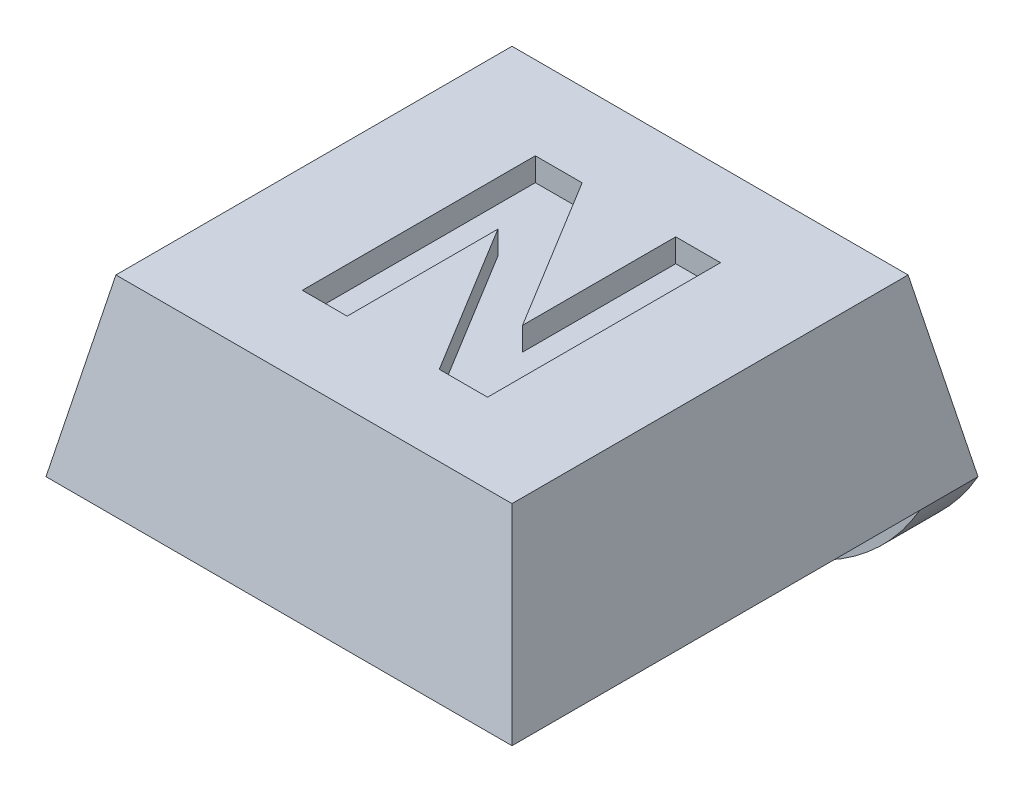
ISO-10303-21;
HEADER;
FILE_DESCRIPTION(('STEP AP214'),'2;1');
FILE_NAME('part.step','',(''),(''),'','','');
FILE_SCHEMA(('AUTOMOTIVE_DESIGN { 1 0 10303 214 1 1 1 1 }'));
ENDSEC;
DATA;
#1=APPLICATION_CONTEXT('core data for automotive mechanical design processes');
#2=APPLICATION_PROTOCOL_DEFINITION('international standard','automotive_design',2000,#1);
#3=PRODUCT_CONTEXT('',#1,'mechanical');
#4=PRODUCT('Part','Part','',(#3));
#5=PRODUCT_RELATED_PRODUCT_CATEGORY('part','',(#4));
#6=PRODUCT_DEFINITION_FORMATION('','',#4);
#7=PRODUCT_DEFINITION_CONTEXT('part definition',#1,'design');
#8=PRODUCT_DEFINITION('design','',#6,#7);
#9=PRODUCT_DEFINITION_SHAPE('','',#8);
#10=(LENGTH_UNIT() NAMED_UNIT(*) SI_UNIT(.MILLI.,.METRE.));
#11=(NAMED_UNIT(*) PLANE_ANGLE_UNIT() SI_UNIT($,.RADIAN.));
#12=(NAMED_UNIT(*) SI_UNIT($,.STERADIAN.) SOLID_ANGLE_UNIT());
#13=UNCERTAINTY_MEASURE_WITH_UNIT(LENGTH_MEASURE(1.E-05),#10,'distance_accuracy_value','');
#14=(GEOMETRIC_REPRESENTATION_CONTEXT(3) GLOBAL_UNCERTAINTY_ASSIGNED_CONTEXT((#13)) GLOBAL_UNIT_ASSIGNED_CONTEXT((#10,
#11,#12)) REPRESENTATION_CONTEXT('',''));
#15=CARTESIAN_POINT('',(0.,0.,0.));
#16=DIRECTION('',(0.,0.,1.));
#17=DIRECTION('',(1.,0.,0.));
#18=AXIS2_PLACEMENT_3D('',#15,#16,#17);
#19=CARTESIAN_POINT('',(0.,3.,0.));
#20=DIRECTION('',(0.,-1.,0.));
#21=DIRECTION('',(0.,0.,-1.));
#22=AXIS2_PLACEMENT_3D('',#19,#20,#21);
#23=PLANE('',#22);
#24=DIRECTION('',(-1.,0.,0.));
#25=VECTOR('',#24,1.);
#26=CARTESIAN_POINT('',(11.,3.,-0.6));
#27=LINE('',#26,#25);
#28=CARTESIAN_POINT('',(7.4,3.,-0.6));
#29=VERTEX_POINT('',#28);
#30=CARTESIAN_POINT('',(0.6,3.,-0.6));
#31=VERTEX_POINT('',#30);
#32=EDGE_CURVE('E218',#29,#31,#27,.T.);
#33=ORIENTED_EDGE('',*,*,#32,.F.);
#34=DIRECTION('',(0.,0.,1.));
#35=VECTOR('',#34,1.);
#36=CARTESIAN_POINT('',(7.4,3.,-8.));
#37=LINE('',#36,#35);
#38=CARTESIAN_POINT('',(7.4,3.,-7.4));
#39=VERTEX_POINT('',#38);
#40=EDGE_CURVE('E231',#39,#29,#37,.T.);
#41=ORIENTED_EDGE('',*,*,#40,.F.);
#42=DIRECTION('',(-1.,0.,0.));
#43=VECTOR('',#42,1.);
#44=CARTESIAN_POINT('',(11.,3.,-7.4));
#45=LINE('',#44,#43);
#46=CARTESIAN_POINT('',(0.599999999999999,3.,-7.4));
#47=VERTEX_POINT('',#46);
#48=EDGE_CURVE('E214',#39,#47,#45,.T.);
#49=ORIENTED_EDGE('',*,*,#48,.T.);
#50=DIRECTION('',(0.,0.,1.));
#51=VECTOR('',#50,1.);
#52=CARTESIAN_POINT('',(0.6,3.,-8.));
#53=LINE('',#52,#51);
#54=EDGE_CURVE('E234',#47,#31,#53,.T.);
#55=ORIENTED_EDGE('',*,*,#54,.T.);
#56=EDGE_LOOP('',(#33,#41,#49,#55));
#57=FACE_BOUND('',#56,.T.);
#58=DIRECTION('',(-1.,0.,0.));
#59=VECTOR('',#58,1.);
#60=CARTESIAN_POINT('',(3.19779277736189,3.,-1.9720128589146));
#61=LINE('',#60,#59);
#62=CARTESIAN_POINT('',(3.19779277736189,3.,-1.9720128589146));
#63=VERTEX_POINT('',#62);
#64=CARTESIAN_POINT('',(2.42856200813112,3.,-1.9720128589146));
#65=VERTEX_POINT('',#64);
#66=EDGE_CURVE('E59',#63,#65,#61,.T.);
#67=ORIENTED_EDGE('',*,*,#66,.T.);
#68=DIRECTION('',(0.,0.,-1.));
#69=VECTOR('',#68,1.);
#70=CARTESIAN_POINT('',(2.42856200813112,3.,-1.9720128589146));
#71=LINE('',#70,#69);
#72=CARTESIAN_POINT('',(2.42856200813112,3.,-5.9720128589146));
#73=VERTEX_POINT('',#72);
#74=EDGE_CURVE('E186',#65,#73,#71,.T.);
#75=ORIENTED_EDGE('',*,*,#74,.T.);
#76=DIRECTION('',(1.,0.,0.));
#77=VECTOR('',#76,1.);
#78=CARTESIAN_POINT('',(2.42856200813112,3.,-5.9720128589146));
#79=LINE('',#78,#77);
#80=CARTESIAN_POINT('',(3.23224790556701,3.,-5.9720128589146));
#81=VERTEX_POINT('',#80);
#82=EDGE_CURVE('E625',#73,#81,#79,.T.);
#83=ORIENTED_EDGE('',*,*,#82,.T.);
#84=DIRECTION('',(0.521323795742145,0.,0.853358951434274));
#85=VECTOR('',#84,1.);
#86=CARTESIAN_POINT('',(3.23224790556701,3.,-5.9720128589146));
#87=LINE('',#86,#85);
#88=CARTESIAN_POINT('',(4.83881841838753,3.,-3.34220516660691));
#89=VERTEX_POINT('',#88);
#90=EDGE_CURVE('E627',#81,#89,#87,.T.);
#91=ORIENTED_EDGE('',*,*,#90,.T.);
#92=DIRECTION('',(0.,0.,-1.));
#93=VECTOR('',#92,1.);
#94=CARTESIAN_POINT('',(4.83881841838753,3.,-3.34220516660691));
#95=LINE('',#94,#93);
#96=CARTESIAN_POINT('',(4.83881841838753,3.,-5.9720128589146));
#97=VERTEX_POINT('',#96);
#98=EDGE_CURVE('E632',#89,#97,#95,.T.);
#99=ORIENTED_EDGE('',*,*,#98,.T.);
#100=DIRECTION('',(1.,0.,0.));
#101=VECTOR('',#100,1.);
#102=CARTESIAN_POINT('',(4.83881841838753,3.,-5.9720128589146));
#103=LINE('',#102,#101);
#104=CARTESIAN_POINT('',(5.6080491876183,3.,-5.9720128589146));
#105=VERTEX_POINT('',#104);
#106=EDGE_CURVE('E642',#97,#105,#103,.T.);
#107=ORIENTED_EDGE('',*,*,#106,.T.);
#108=DIRECTION('',(0.,0.,1.));
#109=VECTOR('',#108,1.);
#110=CARTESIAN_POINT('',(5.6080491876183,3.,-5.9720128589146));
#111=LINE('',#110,#109);
#112=CARTESIAN_POINT('',(5.6080491876183,3.,-1.9720128589146));
#113=VERTEX_POINT('',#112);
#114=EDGE_CURVE('E597',#105,#113,#111,.T.);
#115=ORIENTED_EDGE('',*,*,#114,.T.);
#116=DIRECTION('',(-1.,0.,0.));
#117=VECTOR('',#116,1.);
#118=CARTESIAN_POINT('',(5.6080491876183,3.,-1.9720128589146));
#119=LINE('',#118,#117);
#120=CARTESIAN_POINT('',(4.77952354659266,3.,-1.9720128589146));
#121=VERTEX_POINT('',#120);
#122=EDGE_CURVE('E592',#113,#121,#119,.T.);
#123=ORIENTED_EDGE('',*,*,#122,.T.);
#124=DIRECTION('',(-0.521471380338423,0.,-0.853268773299445));
#125=VECTOR('',#124,1.);
#126=CARTESIAN_POINT('',(4.77952354659266,3.,-1.9720128589146));
#127=LINE('',#126,#125);
#128=CARTESIAN_POINT('',(3.19779277736189,3.,-4.56015388455563));
#129=VERTEX_POINT('',#128);
#130=EDGE_CURVE('E586',#121,#129,#127,.T.);
#131=ORIENTED_EDGE('',*,*,#130,.T.);
#132=DIRECTION('',(0.,0.,1.));
#133=VECTOR('',#132,1.);
#134=CARTESIAN_POINT('',(3.19779277736189,3.,-4.56015388455563));
#135=LINE('',#134,#133);
#136=EDGE_CURVE('E182',#129,#63,#135,.T.);
#137=ORIENTED_EDGE('',*,*,#136,.T.);
#138=EDGE_LOOP('',(#67,#75,#83,#91,#99,#107,#115,#123,#131,#137));
#139=FACE_BOUND('',#138,.T.);
#140=ADVANCED_FACE('F43',(#57,#139),#23,.F.);
#141=CARTESIAN_POINT('',(8.,0.,-8.));
#142=DIRECTION('',(-0.98058067569092,-0.196116135138184,0.));
#143=DIRECTION('',(0.196116135138184,-0.98058067569092,0.));
#144=AXIS2_PLACEMENT_3D('',#141,#142,#143);
#145=PLANE('',#144);
#146=DIRECTION('',(-0.192450089729875,0.962250448649376,-0.192450089729875));
#147=VECTOR('',#146,1.);
#148=CARTESIAN_POINT('',(7.7037037037037,1.48148148148148,-0.296296296296296));
#149=LINE('',#148,#147);
#150=CARTESIAN_POINT('',(8.,0.,0.));
#151=VERTEX_POINT('',#150);
#152=EDGE_CURVE('E228',#151,#29,#149,.T.);
#153=ORIENTED_EDGE('',*,*,#152,.F.);
#154=DIRECTION('',(0.,0.,-1.));
#155=VECTOR('',#154,1.);
#156=CARTESIAN_POINT('',(8.,0.,0.));
#157=LINE('',#156,#155);
#158=CARTESIAN_POINT('',(8.,0.,-7.));
#159=VERTEX_POINT('',#158);
#160=EDGE_CURVE('E247',#151,#159,#157,.T.);
#161=ORIENTED_EDGE('',*,*,#160,.T.);
#162=DIRECTION('',(0.,0.,1.));
#163=VECTOR('',#162,1.);
#164=CARTESIAN_POINT('',(8.,0.,-8.));
#165=LINE('',#164,#163);
#166=CARTESIAN_POINT('',(8.,0.,-8.));
#167=VERTEX_POINT('',#166);
#168=EDGE_CURVE('E188',#167,#159,#165,.T.);
#169=ORIENTED_EDGE('',*,*,#168,.F.);
#170=DIRECTION('',(0.192450089729875,-0.962250448649376,-0.192450089729875));
#171=VECTOR('',#170,1.);
#172=CARTESIAN_POINT('',(8.,0.,-8.));
#173=LINE('',#172,#171);
#174=EDGE_CURVE('E221',#39,#167,#173,.T.);
#175=ORIENTED_EDGE('',*,*,#174,.F.);
#176=ORIENTED_EDGE('',*,*,#40,.T.);
#177=EDGE_LOOP('',(#153,#161,#169,#175,#176));
#178=FACE_BOUND('',#177,.T.);
#179=ADVANCED_FACE('F315',(#178),#145,.F.);
#180=CARTESIAN_POINT('',(0.,0.,-8.));
#181=DIRECTION('',(0.98058067569092,-0.196116135138184,0.));
#182=DIRECTION('',(0.196116135138184,0.98058067569092,0.));
#183=AXIS2_PLACEMENT_3D('',#180,#181,#182);
#184=PLANE('',#183);
#185=DIRECTION('',(-0.192450089729875,-0.962250448649376,0.192450089729875));
#186=VECTOR('',#185,1.);
#187=CARTESIAN_POINT('',(0.296296296296296,1.48148148148148,-0.296296296296296));
#188=LINE('',#187,#186);
#189=CARTESIAN_POINT('',(0.,0.,0.));
#190=VERTEX_POINT('',#189);
#191=EDGE_CURVE('E275',#31,#190,#188,.T.);
#192=ORIENTED_EDGE('',*,*,#191,.F.);
#193=ORIENTED_EDGE('',*,*,#54,.F.);
#194=DIRECTION('',(0.192450089729875,0.962250448649376,0.192450089729875));
#195=VECTOR('',#194,1.);
#196=CARTESIAN_POINT('',(0.,0.,-8.));
#197=LINE('',#196,#195);
#198=CARTESIAN_POINT('',(0.,0.,-8.));
#199=VERTEX_POINT('',#198);
#200=EDGE_CURVE('E246',#199,#47,#197,.T.);
#201=ORIENTED_EDGE('',*,*,#200,.F.);
#202=DIRECTION('',(0.,0.,1.));
#203=VECTOR('',#202,1.);
#204=CARTESIAN_POINT('',(0.,0.,0.));
#205=LINE('',#204,#203);
#206=CARTESIAN_POINT('',(0.,0.,-7.));
#207=VERTEX_POINT('',#206);
#208=EDGE_CURVE('E251',#199,#207,#205,.T.);
#209=ORIENTED_EDGE('',*,*,#208,.T.);
#210=EDGE_CURVE('E238',#207,#190,#205,.T.);
#211=ORIENTED_EDGE('',*,*,#210,.T.);
#212=EDGE_LOOP('',(#192,#193,#201,#209,#211));
#213=FACE_BOUND('',#212,.T.);
#214=ADVANCED_FACE('F299',(#213),#184,.F.);
#215=CARTESIAN_POINT('',(0.,0.,0.));
#216=DIRECTION('',(0.,-1.,0.));
#217=DIRECTION('',(0.,0.,-1.));
#218=AXIS2_PLACEMENT_3D('',#215,#216,#217);
#219=PLANE('',#218);
#220=DIRECTION('',(-1.,0.,0.));
#221=VECTOR('',#220,1.);
#222=CARTESIAN_POINT('',(0.,0.,-7.));
#223=LINE('',#222,#221);
#224=EDGE_CURVE('E194',#159,#207,#223,.T.);
#225=ORIENTED_EDGE('',*,*,#224,.F.);
#226=ORIENTED_EDGE('',*,*,#160,.F.);
#227=DIRECTION('',(1.,0.,0.));
#228=VECTOR('',#227,1.);
#229=CARTESIAN_POINT('',(0.,0.,0.));
#230=LINE('',#229,#228);
#231=EDGE_CURVE('E248',#190,#151,#230,.T.);
#232=ORIENTED_EDGE('',*,*,#231,.F.);
#233=ORIENTED_EDGE('',*,*,#210,.F.);
#234=EDGE_LOOP('',(#225,#226,#232,#233));
#235=FACE_BOUND('',#234,.T.);
#236=CARTESIAN_POINT('',(4.,0.,-3.75));
#237=DIRECTION('',(0.,-1.,0.));
#238=DIRECTION('',(0.,0.,-1.));
#239=AXIS2_PLACEMENT_3D('',#236,#237,#238);
#240=CIRCLE('',#239,1.75);
#241=CARTESIAN_POINT('',(4.,0.,-5.5));
#242=VERTEX_POINT('',#241);
#243=EDGE_CURVE('E206',#242,#242,#240,.T.);
#244=ORIENTED_EDGE('',*,*,#243,.F.);
#245=EDGE_LOOP('',(#244));
#246=FACE_BOUND('',#245,.T.);
#247=ADVANCED_FACE('F310',(#235,#246),#219,.T.);
#248=CARTESIAN_POINT('',(11.,3.,-7.4));
#249=DIRECTION('',(0.,0.196116135138184,-0.98058067569092));
#250=DIRECTION('',(0.,0.98058067569092,0.196116135138184));
#251=AXIS2_PLACEMENT_3D('',#248,#249,#250);
#252=PLANE('',#251);
#253=ORIENTED_EDGE('',*,*,#174,.T.);
#254=DIRECTION('',(-1.,0.,0.));
#255=VECTOR('',#254,1.);
#256=CARTESIAN_POINT('',(0.,0.,-8.));
#257=LINE('',#256,#255);
#258=EDGE_CURVE('E242',#167,#199,#257,.T.);
#259=ORIENTED_EDGE('',*,*,#258,.T.);
#260=ORIENTED_EDGE('',*,*,#200,.T.);
#261=ORIENTED_EDGE('',*,*,#48,.F.);
#262=EDGE_LOOP('',(#253,#259,#260,#261));
#263=FACE_BOUND('',#262,.T.);
#264=ADVANCED_FACE('F294',(#263),#252,.T.);
#265=CARTESIAN_POINT('',(11.,0.,0.));
#266=DIRECTION('',(0.,0.196116135138184,0.98058067569092));
#267=DIRECTION('',(0.,-0.98058067569092,0.196116135138184));
#268=AXIS2_PLACEMENT_3D('',#265,#266,#267);
#269=PLANE('',#268);
#270=ORIENTED_EDGE('',*,*,#152,.T.);
#271=ORIENTED_EDGE('',*,*,#32,.T.);
#272=ORIENTED_EDGE('',*,*,#191,.T.);
#273=ORIENTED_EDGE('',*,*,#231,.T.);
#274=EDGE_LOOP('',(#270,#271,#272,#273));
#275=FACE_BOUND('',#274,.T.);
#276=ADVANCED_FACE('F339',(#275),#269,.T.);
#277=CARTESIAN_POINT('',(4.,0.4,-3.75));
#278=DIRECTION('',(0.,-1.,0.));
#279=DIRECTION('',(0.,0.,-1.));
#280=AXIS2_PLACEMENT_3D('',#277,#278,#279);
#281=CYLINDRICAL_SURFACE('',#280,1.75);
#282=CARTESIAN_POINT('',(4.,0.4,-3.75));
#283=DIRECTION('',(0.,-1.,0.));
#284=DIRECTION('',(0.,0.,-1.));
#285=AXIS2_PLACEMENT_3D('',#282,#283,#284);
#286=CIRCLE('',#285,1.75);
#287=CARTESIAN_POINT('',(4.,0.4,-5.5));
#288=VERTEX_POINT('',#287);
#289=EDGE_CURVE('E210',#288,#288,#286,.T.);
#290=ORIENTED_EDGE('',*,*,#289,.F.);
#291=EDGE_LOOP('',(#290));
#292=FACE_BOUND('',#291,.T.);
#293=ORIENTED_EDGE('',*,*,#243,.T.);
#294=EDGE_LOOP('',(#293));
#295=FACE_BOUND('',#294,.T.);
#296=ADVANCED_FACE('F346',(#292,#295),#281,.F.);
#297=CARTESIAN_POINT('',(4.,0.4,-3.75));
#298=DIRECTION('',(0.,-1.,0.));
#299=DIRECTION('',(0.,0.,-1.));
#300=AXIS2_PLACEMENT_3D('',#297,#298,#299);
#301=PLANE('',#300);
#302=ORIENTED_EDGE('',*,*,#289,.T.);
#303=EDGE_LOOP('',(#302));
#304=FACE_BOUND('',#303,.T.);
#305=ADVANCED_FACE('F350',(#304),#301,.T.);
#306=CARTESIAN_POINT('',(0.,-2.,-8.));
#307=DIRECTION('',(0.,0.,1.));
#308=DIRECTION('',(1.,0.,0.));
#309=AXIS2_PLACEMENT_3D('',#306,#307,#308);
#310=PLANE('',#309);
#311=ORIENTED_EDGE('',*,*,#258,.F.);
#312=CARTESIAN_POINT('',(4.53589838486225,2.,-8.));
#313=DIRECTION('',(0.,0.,1.));
#314=DIRECTION('',(1.,0.,0.));
#315=AXIS2_PLACEMENT_3D('',#312,#313,#314);
#316=CIRCLE('',#315,4.);
#317=CARTESIAN_POINT('',(4.53589838486225,-2.,-8.));
#318=VERTEX_POINT('',#317);
#319=EDGE_CURVE('E11',#167,#318,#316,.F.);
#320=ORIENTED_EDGE('',*,*,#319,.T.);
#321=DIRECTION('',(1.,0.,0.));
#322=VECTOR('',#321,1.);
#323=CARTESIAN_POINT('',(0.,-2.,-8.));
#324=LINE('',#323,#322);
#325=CARTESIAN_POINT('',(3.46410161513775,-2.,-8.));
#326=VERTEX_POINT('',#325);
#327=EDGE_CURVE('E200',#326,#318,#324,.T.);
#328=ORIENTED_EDGE('',*,*,#327,.F.);
#329=CARTESIAN_POINT('',(3.46410161513775,2.,-8.));
#330=DIRECTION('',(0.,0.,1.));
#331=DIRECTION('',(1.,0.,0.));
#332=AXIS2_PLACEMENT_3D('',#329,#330,#331);
#333=CIRCLE('',#332,4.);
#334=EDGE_CURVE('E52',#326,#199,#333,.F.);
#335=ORIENTED_EDGE('',*,*,#334,.T.);
#336=EDGE_LOOP('',(#311,#320,#328,#335));
#337=FACE_BOUND('',#336,.T.);
#338=ADVANCED_FACE('F287',(#337),#310,.F.);
#339=CARTESIAN_POINT('',(0.,-2.,-7.));
#340=DIRECTION('',(0.,0.,-1.));
#341=DIRECTION('',(-1.,0.,0.));
#342=AXIS2_PLACEMENT_3D('',#339,#340,#341);
#343=PLANE('',#342);
#344=DIRECTION('',(-1.,0.,0.));
#345=VECTOR('',#344,1.);
#346=CARTESIAN_POINT('',(0.,-2.,-7.));
#347=LINE('',#346,#345);
#348=CARTESIAN_POINT('',(4.53589838486225,-2.,-7.));
#349=VERTEX_POINT('',#348);
#350=CARTESIAN_POINT('',(3.46410161513775,-2.,-7.));
#351=VERTEX_POINT('',#350);
#352=EDGE_CURVE('E204',#349,#351,#347,.T.);
#353=ORIENTED_EDGE('',*,*,#352,.F.);
#354=CARTESIAN_POINT('',(4.53589838486225,2.,-7.));
#355=DIRECTION('',(0.,0.,-1.));
#356=DIRECTION('',(-1.,0.,0.));
#357=AXIS2_PLACEMENT_3D('',#354,#355,#356);
#358=CIRCLE('',#357,4.);
#359=EDGE_CURVE('E281',#349,#159,#358,.F.);
#360=ORIENTED_EDGE('',*,*,#359,.T.);
#361=ORIENTED_EDGE('',*,*,#224,.T.);
#362=CARTESIAN_POINT('',(3.46410161513775,2.,-7.));
#363=DIRECTION('',(0.,0.,-1.));
#364=DIRECTION('',(-1.,0.,0.));
#365=AXIS2_PLACEMENT_3D('',#362,#363,#364);
#366=CIRCLE('',#365,4.);
#367=EDGE_CURVE('E67',#207,#351,#366,.F.);
#368=ORIENTED_EDGE('',*,*,#367,.T.);
#369=EDGE_LOOP('',(#353,#360,#361,#368));
#370=FACE_BOUND('',#369,.T.);
#371=ADVANCED_FACE('F305',(#370),#343,.F.);
#372=CARTESIAN_POINT('',(0.,-2.,0.));
#373=DIRECTION('',(0.,1.,0.));
#374=DIRECTION('',(0.,0.,1.));
#375=AXIS2_PLACEMENT_3D('',#372,#373,#374);
#376=PLANE('',#375);
#377=ORIENTED_EDGE('',*,*,#327,.T.);
#378=DIRECTION('',(0.,0.,1.));
#379=VECTOR('',#378,1.);
#380=CARTESIAN_POINT('',(4.53589838486225,-2.,0.));
#381=LINE('',#380,#379);
#382=EDGE_CURVE('E274',#318,#349,#381,.T.);
#383=ORIENTED_EDGE('',*,*,#382,.T.);
#384=ORIENTED_EDGE('',*,*,#352,.T.);
#385=DIRECTION('',(0.,0.,-1.));
#386=VECTOR('',#385,1.);
#387=CARTESIAN_POINT('',(3.46410161513775,-2.,0.));
#388=LINE('',#387,#386);
#389=EDGE_CURVE('E270',#351,#326,#388,.T.);
#390=ORIENTED_EDGE('',*,*,#389,.T.);
#391=EDGE_LOOP('',(#377,#383,#384,#390));
#392=FACE_BOUND('',#391,.T.);
#393=ADVANCED_FACE('F303',(#392),#376,.F.);
#394=CARTESIAN_POINT('',(4.53589838486225,2.,-8.));
#395=DIRECTION('',(0.,0.,1.));
#396=DIRECTION('',(1.,0.,0.));
#397=AXIS2_PLACEMENT_3D('',#394,#395,#396);
#398=CYLINDRICAL_SURFACE('',#397,4.);
#399=ORIENTED_EDGE('',*,*,#319,.F.);
#400=ORIENTED_EDGE('',*,*,#168,.T.);
#401=ORIENTED_EDGE('',*,*,#359,.F.);
#402=ORIENTED_EDGE('',*,*,#382,.F.);
#403=EDGE_LOOP('',(#399,#400,#401,#402));
#404=FACE_BOUND('',#403,.T.);
#405=ADVANCED_FACE('F316',(#404),#398,.T.);
#406=CARTESIAN_POINT('',(3.46410161513775,2.,-8.));
#407=DIRECTION('',(0.,0.,-1.));
#408=DIRECTION('',(-1.,0.,0.));
#409=AXIS2_PLACEMENT_3D('',#406,#407,#408);
#410=CYLINDRICAL_SURFACE('',#409,4.);
#411=ORIENTED_EDGE('',*,*,#367,.F.);
#412=ORIENTED_EDGE('',*,*,#208,.F.);
#413=ORIENTED_EDGE('',*,*,#334,.F.);
#414=ORIENTED_EDGE('',*,*,#389,.F.);
#415=EDGE_LOOP('',(#411,#412,#413,#414));
#416=FACE_BOUND('',#415,.T.);
#417=ADVANCED_FACE('F45',(#416),#410,.T.);
#418=CARTESIAN_POINT('',(3.19779277736189,2.6,-1.9720128589146));
#419=DIRECTION('',(0.,0.,-1.));
#420=DIRECTION('',(-1.,0.,0.));
#421=AXIS2_PLACEMENT_3D('',#418,#419,#420);
#422=PLANE('',#421);
#423=ORIENTED_EDGE('',*,*,#66,.F.);
#424=DIRECTION('',(0.,1.,0.));
#425=VECTOR('',#424,1.);
#426=CARTESIAN_POINT('',(3.19779277736189,2.6,-1.9720128589146));
#427=LINE('',#426,#425);
#428=CARTESIAN_POINT('',(3.19779277736189,2.6,-1.9720128589146));
#429=VERTEX_POINT('',#428);
#430=EDGE_CURVE('E180',#429,#63,#427,.T.);
#431=ORIENTED_EDGE('',*,*,#430,.F.);
#432=DIRECTION('',(-1.,0.,0.));
#433=VECTOR('',#432,1.);
#434=CARTESIAN_POINT('',(3.19779277736189,2.6,-1.9720128589146));
#435=LINE('',#434,#433);
#436=CARTESIAN_POINT('',(2.42856200813112,2.6,-1.9720128589146));
#437=VERTEX_POINT('',#436);
#438=EDGE_CURVE('E170',#429,#437,#435,.T.);
#439=ORIENTED_EDGE('',*,*,#438,.T.);
#440=DIRECTION('',(0.,1.,0.));
#441=VECTOR('',#440,1.);
#442=CARTESIAN_POINT('',(2.42856200813112,2.6,-1.9720128589146));
#443=LINE('',#442,#441);
#444=EDGE_CURVE('E179',#437,#65,#443,.T.);
#445=ORIENTED_EDGE('',*,*,#444,.T.);
#446=EDGE_LOOP('',(#423,#431,#439,#445));
#447=FACE_BOUND('',#446,.T.);
#448=ADVANCED_FACE('F178',(#447),#422,.T.);
#449=CARTESIAN_POINT('',(2.42856200813112,2.6,-1.9720128589146));
#450=DIRECTION('',(1.,0.,0.));
#451=DIRECTION('',(0.,0.,-1.));
#452=AXIS2_PLACEMENT_3D('',#449,#450,#451);
#453=PLANE('',#452);
#454=ORIENTED_EDGE('',*,*,#74,.F.);
#455=ORIENTED_EDGE('',*,*,#444,.F.);
#456=DIRECTION('',(0.,0.,-1.));
#457=VECTOR('',#456,1.);
#458=CARTESIAN_POINT('',(2.42856200813112,2.6,-1.9720128589146));
#459=LINE('',#458,#457);
#460=CARTESIAN_POINT('',(2.42856200813112,2.6,-5.9720128589146));
#461=VERTEX_POINT('',#460);
#462=EDGE_CURVE('E166',#437,#461,#459,.T.);
#463=ORIENTED_EDGE('',*,*,#462,.T.);
#464=DIRECTION('',(0.,1.,0.));
#465=VECTOR('',#464,1.);
#466=CARTESIAN_POINT('',(2.42856200813112,2.6,-5.9720128589146));
#467=LINE('',#466,#465);
#468=EDGE_CURVE('E189',#461,#73,#467,.T.);
#469=ORIENTED_EDGE('',*,*,#468,.T.);
#470=EDGE_LOOP('',(#454,#455,#463,#469));
#471=FACE_BOUND('',#470,.T.);
#472=ADVANCED_FACE('F184',(#471),#453,.T.);
#473=CARTESIAN_POINT('',(2.42856200813112,2.6,-5.9720128589146));
#474=DIRECTION('',(0.,0.,1.));
#475=DIRECTION('',(1.,0.,0.));
#476=AXIS2_PLACEMENT_3D('',#473,#474,#475);
#477=PLANE('',#476);
#478=ORIENTED_EDGE('',*,*,#82,.F.);
#479=ORIENTED_EDGE('',*,*,#468,.F.);
#480=DIRECTION('',(1.,0.,0.));
#481=VECTOR('',#480,1.);
#482=CARTESIAN_POINT('',(2.42856200813112,2.6,-5.9720128589146));
#483=LINE('',#482,#481);
#484=CARTESIAN_POINT('',(3.23224790556701,2.6,-5.9720128589146));
#485=VERTEX_POINT('',#484);
#486=EDGE_CURVE('E172',#461,#485,#483,.T.);
#487=ORIENTED_EDGE('',*,*,#486,.T.);
#488=DIRECTION('',(0.,1.,0.));
#489=VECTOR('',#488,1.);
#490=CARTESIAN_POINT('',(3.23224790556701,2.6,-5.9720128589146));
#491=LINE('',#490,#489);
#492=EDGE_CURVE('E196',#485,#81,#491,.T.);
#493=ORIENTED_EDGE('',*,*,#492,.T.);
#494=EDGE_LOOP('',(#478,#479,#487,#493));
#495=FACE_BOUND('',#494,.T.);
#496=ADVANCED_FACE('F363',(#495),#477,.T.);
#497=CARTESIAN_POINT('',(3.23224790556701,2.6,-5.9720128589146));
#498=DIRECTION('',(-0.853358951434274,0.,0.521323795742145));
#499=DIRECTION('',(0.521323795742145,0.,0.853358951434274));
#500=AXIS2_PLACEMENT_3D('',#497,#498,#499);
#501=PLANE('',#500);
#502=ORIENTED_EDGE('',*,*,#90,.F.);
#503=ORIENTED_EDGE('',*,*,#492,.F.);
#504=DIRECTION('',(0.521323795742145,0.,0.853358951434274));
#505=VECTOR('',#504,1.);
#506=CARTESIAN_POINT('',(3.23224790556701,2.6,-5.9720128589146));
#507=LINE('',#506,#505);
#508=CARTESIAN_POINT('',(4.83881841838753,2.6,-3.34220516660691));
#509=VERTEX_POINT('',#508);
#510=EDGE_CURVE('E672',#485,#509,#507,.T.);
#511=ORIENTED_EDGE('',*,*,#510,.T.);
#512=DIRECTION('',(0.,1.,0.));
#513=VECTOR('',#512,1.);
#514=CARTESIAN_POINT('',(4.83881841838753,2.6,-3.34220516660691));
#515=LINE('',#514,#513);
#516=EDGE_CURVE('E618',#509,#89,#515,.T.);
#517=ORIENTED_EDGE('',*,*,#516,.T.);
#518=EDGE_LOOP('',(#502,#503,#511,#517));
#519=FACE_BOUND('',#518,.T.);
#520=ADVANCED_FACE('F366',(#519),#501,.T.);
#521=CARTESIAN_POINT('',(4.83881841838753,2.6,-3.34220516660691));
#522=DIRECTION('',(1.,0.,0.));
#523=DIRECTION('',(0.,0.,-1.));
#524=AXIS2_PLACEMENT_3D('',#521,#522,#523);
#525=PLANE('',#524);
#526=ORIENTED_EDGE('',*,*,#98,.F.);
#527=ORIENTED_EDGE('',*,*,#516,.F.);
#528=DIRECTION('',(0.,0.,-1.));
#529=VECTOR('',#528,1.);
#530=CARTESIAN_POINT('',(4.83881841838753,2.6,-3.34220516660691));
#531=LINE('',#530,#529);
#532=CARTESIAN_POINT('',(4.83881841838753,2.6,-5.9720128589146));
#533=VERTEX_POINT('',#532);
#534=EDGE_CURVE('E669',#509,#533,#531,.T.);
#535=ORIENTED_EDGE('',*,*,#534,.T.);
#536=DIRECTION('',(0.,1.,0.));
#537=VECTOR('',#536,1.);
#538=CARTESIAN_POINT('',(4.83881841838753,2.6,-5.9720128589146));
#539=LINE('',#538,#537);
#540=EDGE_CURVE('E615',#533,#97,#539,.T.);
#541=ORIENTED_EDGE('',*,*,#540,.T.);
#542=EDGE_LOOP('',(#526,#527,#535,#541));
#543=FACE_BOUND('',#542,.T.);
#544=ADVANCED_FACE('F370',(#543),#525,.T.);
#545=CARTESIAN_POINT('',(4.83881841838753,2.6,-5.9720128589146));
#546=DIRECTION('',(0.,0.,1.));
#547=DIRECTION('',(1.,0.,0.));
#548=AXIS2_PLACEMENT_3D('',#545,#546,#547);
#549=PLANE('',#548);
#550=ORIENTED_EDGE('',*,*,#106,.F.);
#551=ORIENTED_EDGE('',*,*,#540,.F.);
#552=DIRECTION('',(1.,0.,0.));
#553=VECTOR('',#552,1.);
#554=CARTESIAN_POINT('',(4.83881841838753,2.6,-5.9720128589146));
#555=LINE('',#554,#553);
#556=CARTESIAN_POINT('',(5.6080491876183,2.6,-5.9720128589146));
#557=VERTEX_POINT('',#556);
#558=EDGE_CURVE('E666',#533,#557,#555,.T.);
#559=ORIENTED_EDGE('',*,*,#558,.T.);
#560=DIRECTION('',(0.,1.,0.));
#561=VECTOR('',#560,1.);
#562=CARTESIAN_POINT('',(5.6080491876183,2.6,-5.9720128589146));
#563=LINE('',#562,#561);
#564=EDGE_CURVE('E612',#557,#105,#563,.T.);
#565=ORIENTED_EDGE('',*,*,#564,.T.);
#566=EDGE_LOOP('',(#550,#551,#559,#565));
#567=FACE_BOUND('',#566,.T.);
#568=ADVANCED_FACE('F374',(#567),#549,.T.);
#569=CARTESIAN_POINT('',(5.6080491876183,2.6,-5.9720128589146));
#570=DIRECTION('',(-1.,0.,0.));
#571=DIRECTION('',(0.,0.,1.));
#572=AXIS2_PLACEMENT_3D('',#569,#570,#571);
#573=PLANE('',#572);
#574=ORIENTED_EDGE('',*,*,#114,.F.);
#575=ORIENTED_EDGE('',*,*,#564,.F.);
#576=DIRECTION('',(0.,0.,1.));
#577=VECTOR('',#576,1.);
#578=CARTESIAN_POINT('',(5.6080491876183,2.6,-5.9720128589146));
#579=LINE('',#578,#577);
#580=CARTESIAN_POINT('',(5.6080491876183,2.6,-1.9720128589146));
#581=VERTEX_POINT('',#580);
#582=EDGE_CURVE('E651',#557,#581,#579,.T.);
#583=ORIENTED_EDGE('',*,*,#582,.T.);
#584=DIRECTION('',(0.,1.,0.));
#585=VECTOR('',#584,1.);
#586=CARTESIAN_POINT('',(5.6080491876183,2.6,-1.9720128589146));
#587=LINE('',#586,#585);
#588=EDGE_CURVE('E609',#581,#113,#587,.T.);
#589=ORIENTED_EDGE('',*,*,#588,.T.);
#590=EDGE_LOOP('',(#574,#575,#583,#589));
#591=FACE_BOUND('',#590,.T.);
#592=ADVANCED_FACE('F378',(#591),#573,.T.);
#593=CARTESIAN_POINT('',(5.6080491876183,2.6,-1.9720128589146));
#594=DIRECTION('',(0.,0.,-1.));
#595=DIRECTION('',(-1.,0.,0.));
#596=AXIS2_PLACEMENT_3D('',#593,#594,#595);
#597=PLANE('',#596);
#598=ORIENTED_EDGE('',*,*,#122,.F.);
#599=ORIENTED_EDGE('',*,*,#588,.F.);
#600=DIRECTION('',(-1.,0.,0.));
#601=VECTOR('',#600,1.);
#602=CARTESIAN_POINT('',(5.6080491876183,2.6,-1.9720128589146));
#603=LINE('',#602,#601);
#604=CARTESIAN_POINT('',(4.77952354659266,2.6,-1.9720128589146));
#605=VERTEX_POINT('',#604);
#606=EDGE_CURVE('E653',#581,#605,#603,.T.);
#607=ORIENTED_EDGE('',*,*,#606,.T.);
#608=DIRECTION('',(0.,1.,0.));
#609=VECTOR('',#608,1.);
#610=CARTESIAN_POINT('',(4.77952354659266,2.6,-1.9720128589146));
#611=LINE('',#610,#609);
#612=EDGE_CURVE('E606',#605,#121,#611,.T.);
#613=ORIENTED_EDGE('',*,*,#612,.T.);
#614=EDGE_LOOP('',(#598,#599,#607,#613));
#615=FACE_BOUND('',#614,.T.);
#616=ADVANCED_FACE('F382',(#615),#597,.T.);
#617=CARTESIAN_POINT('',(4.77952354659266,2.6,-1.9720128589146));
#618=DIRECTION('',(0.853268773299445,0.,-0.521471380338423));
#619=DIRECTION('',(-0.521471380338423,0.,-0.853268773299445));
#620=AXIS2_PLACEMENT_3D('',#617,#618,#619);
#621=PLANE('',#620);
#622=ORIENTED_EDGE('',*,*,#130,.F.);
#623=ORIENTED_EDGE('',*,*,#612,.F.);
#624=DIRECTION('',(-0.521471380338423,0.,-0.853268773299445));
#625=VECTOR('',#624,1.);
#626=CARTESIAN_POINT('',(4.77952354659266,2.6,-1.9720128589146));
#627=LINE('',#626,#625);
#628=CARTESIAN_POINT('',(3.19779277736189,2.6,-4.56015388455563));
#629=VERTEX_POINT('',#628);
#630=EDGE_CURVE('E655',#605,#629,#627,.T.);
#631=ORIENTED_EDGE('',*,*,#630,.T.);
#632=DIRECTION('',(0.,1.,0.));
#633=VECTOR('',#632,1.);
#634=CARTESIAN_POINT('',(3.19779277736189,2.6,-4.56015388455563));
#635=LINE('',#634,#633);
#636=EDGE_CURVE('E584',#629,#129,#635,.T.);
#637=ORIENTED_EDGE('',*,*,#636,.T.);
#638=EDGE_LOOP('',(#622,#623,#631,#637));
#639=FACE_BOUND('',#638,.T.);
#640=ADVANCED_FACE('F386',(#639),#621,.T.);
#641=CARTESIAN_POINT('',(3.19779277736189,2.6,-4.56015388455563));
#642=DIRECTION('',(-1.,0.,0.));
#643=DIRECTION('',(0.,0.,1.));
#644=AXIS2_PLACEMENT_3D('',#641,#642,#643);
#645=PLANE('',#644);
#646=ORIENTED_EDGE('',*,*,#136,.F.);
#647=ORIENTED_EDGE('',*,*,#636,.F.);
#648=DIRECTION('',(0.,0.,1.));
#649=VECTOR('',#648,1.);
#650=CARTESIAN_POINT('',(3.19779277736189,2.6,-4.56015388455563));
#651=LINE('',#650,#649);
#652=EDGE_CURVE('E603',#629,#429,#651,.T.);
#653=ORIENTED_EDGE('',*,*,#652,.T.);
#654=ORIENTED_EDGE('',*,*,#430,.T.);
#655=EDGE_LOOP('',(#646,#647,#653,#654));
#656=FACE_BOUND('',#655,.T.);
#657=ADVANCED_FACE('F390',(#656),#645,.T.);
#658=CARTESIAN_POINT('',(0.,2.6,0.));
#659=DIRECTION('',(0.,-1.,0.));
#660=DIRECTION('',(0.,0.,-1.));
#661=AXIS2_PLACEMENT_3D('',#658,#659,#660);
#662=PLANE('',#661);
#663=ORIENTED_EDGE('',*,*,#438,.F.);
#664=ORIENTED_EDGE('',*,*,#652,.F.);
#665=ORIENTED_EDGE('',*,*,#630,.F.);
#666=ORIENTED_EDGE('',*,*,#606,.F.);
#667=ORIENTED_EDGE('',*,*,#582,.F.);
#668=ORIENTED_EDGE('',*,*,#558,.F.);
#669=ORIENTED_EDGE('',*,*,#534,.F.);
#670=ORIENTED_EDGE('',*,*,#510,.F.);
#671=ORIENTED_EDGE('',*,*,#486,.F.);
#672=ORIENTED_EDGE('',*,*,#462,.F.);
#673=EDGE_LOOP('',(#663,#664,#665,#666,#667,#668,#669,#670,#671,#672));
#674=FACE_BOUND('',#673,.T.);
#675=ADVANCED_FACE('F168',(#674),#662,.F.);
#676=CLOSED_SHELL('',(#140,#179,#214,#247,#264,#276,#296,#305,#338,#371,#393,#405,#417,#448,
#472,#496,#520,#544,#568,#592,#616,#640,#657,#675));
#677=MANIFOLD_SOLID_BREP('B2',#676);
#678=ADVANCED_BREP_SHAPE_REPRESENTATION('',(#18,#677),#14);
#679=SHAPE_DEFINITION_REPRESENTATION(#9,#678);
ENDSEC;
END-ISO-10303-21;
